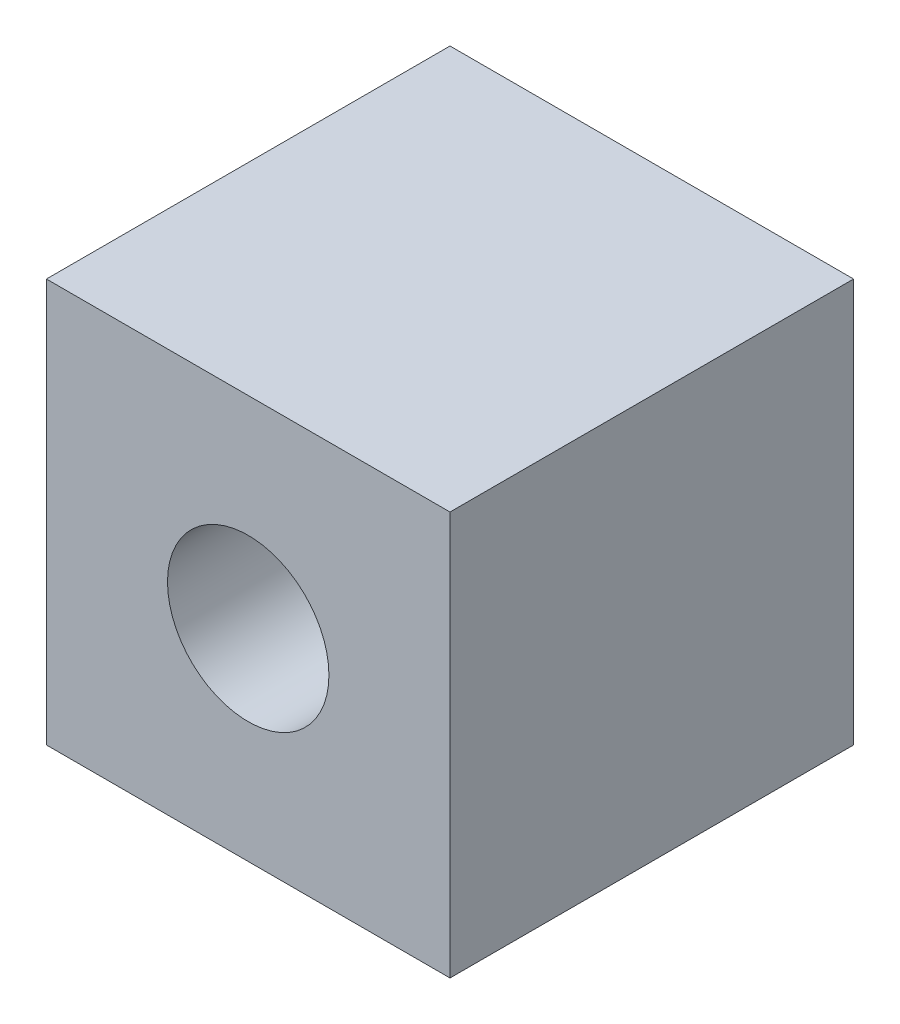
ISO-10303-21;
HEADER;
FILE_DESCRIPTION(('STEP AP214'),'2;1');
FILE_NAME('part.step','',(''),(''),'','','');
FILE_SCHEMA(('AUTOMOTIVE_DESIGN { 1 0 10303 214 1 1 1 1 }'));
ENDSEC;
DATA;
#1=APPLICATION_CONTEXT('core data for automotive mechanical design processes');
#2=APPLICATION_PROTOCOL_DEFINITION('international standard','automotive_design',2000,#1);
#3=PRODUCT_CONTEXT('',#1,'mechanical');
#4=PRODUCT('Part','Part','',(#3));
#5=PRODUCT_RELATED_PRODUCT_CATEGORY('part','',(#4));
#6=PRODUCT_DEFINITION_FORMATION('','',#4);
#7=PRODUCT_DEFINITION_CONTEXT('part definition',#1,'design');
#8=PRODUCT_DEFINITION('design','',#6,#7);
#9=PRODUCT_DEFINITION_SHAPE('','',#8);
#10=(LENGTH_UNIT() NAMED_UNIT(*) SI_UNIT(.MILLI.,.METRE.));
#11=(NAMED_UNIT(*) PLANE_ANGLE_UNIT() SI_UNIT($,.RADIAN.));
#12=(NAMED_UNIT(*) SI_UNIT($,.STERADIAN.) SOLID_ANGLE_UNIT());
#13=UNCERTAINTY_MEASURE_WITH_UNIT(LENGTH_MEASURE(1.E-05),#10,'distance_accuracy_value','');
#14=(GEOMETRIC_REPRESENTATION_CONTEXT(3) GLOBAL_UNCERTAINTY_ASSIGNED_CONTEXT((#13)) GLOBAL_UNIT_ASSIGNED_CONTEXT((#10,
#11,#12)) REPRESENTATION_CONTEXT('',''));
#15=CARTESIAN_POINT('',(0.,0.,0.));
#16=DIRECTION('',(0.,0.,1.));
#17=DIRECTION('',(1.,0.,0.));
#18=AXIS2_PLACEMENT_3D('',#15,#16,#17);
#19=CARTESIAN_POINT('',(0.,0.,10.));
#20=DIRECTION('',(1.,0.,0.));
#21=DIRECTION('',(0.,0.,-1.));
#22=AXIS2_PLACEMENT_3D('',#19,#20,#21);
#23=PLANE('',#22);
#24=DIRECTION('',(0.,-1.,0.));
#25=VECTOR('',#24,1.);
#26=CARTESIAN_POINT('',(0.,0.,0.));
#27=LINE('',#26,#25);
#28=CARTESIAN_POINT('',(0.,10.,0.));
#29=VERTEX_POINT('',#28);
#30=CARTESIAN_POINT('',(0.,0.,0.));
#31=VERTEX_POINT('',#30);
#32=EDGE_CURVE('E98',#29,#31,#27,.T.);
#33=ORIENTED_EDGE('',*,*,#32,.T.);
#34=DIRECTION('',(0.,0.,-1.));
#35=VECTOR('',#34,1.);
#36=CARTESIAN_POINT('',(0.,0.,10.));
#37=LINE('',#36,#35);
#38=CARTESIAN_POINT('',(0.,0.,10.));
#39=VERTEX_POINT('',#38);
#40=EDGE_CURVE('E11',#39,#31,#37,.T.);
#41=ORIENTED_EDGE('',*,*,#40,.F.);
#42=DIRECTION('',(0.,-1.,0.));
#43=VECTOR('',#42,1.);
#44=CARTESIAN_POINT('',(0.,0.,10.));
#45=LINE('',#44,#43);
#46=CARTESIAN_POINT('',(0.,10.,10.));
#47=VERTEX_POINT('',#46);
#48=EDGE_CURVE('E86',#47,#39,#45,.T.);
#49=ORIENTED_EDGE('',*,*,#48,.F.);
#50=DIRECTION('',(0.,0.,-1.));
#51=VECTOR('',#50,1.);
#52=CARTESIAN_POINT('',(0.,10.,10.));
#53=LINE('',#52,#51);
#54=EDGE_CURVE('E94',#47,#29,#53,.T.);
#55=ORIENTED_EDGE('',*,*,#54,.T.);
#56=EDGE_LOOP('',(#33,#41,#49,#55));
#57=FACE_BOUND('',#56,.T.);
#58=ADVANCED_FACE('F35',(#57),#23,.F.);
#59=CARTESIAN_POINT('',(0.,0.,10.));
#60=DIRECTION('',(0.,1.,0.));
#61=DIRECTION('',(0.,0.,1.));
#62=AXIS2_PLACEMENT_3D('',#59,#60,#61);
#63=PLANE('',#62);
#64=DIRECTION('',(1.,0.,0.));
#65=VECTOR('',#64,1.);
#66=CARTESIAN_POINT('',(0.,0.,0.));
#67=LINE('',#66,#65);
#68=CARTESIAN_POINT('',(10.,0.,0.));
#69=VERTEX_POINT('',#68);
#70=EDGE_CURVE('E90',#31,#69,#67,.T.);
#71=ORIENTED_EDGE('',*,*,#70,.T.);
#72=DIRECTION('',(0.,0.,-1.));
#73=VECTOR('',#72,1.);
#74=CARTESIAN_POINT('',(10.,0.,10.));
#75=LINE('',#74,#73);
#76=CARTESIAN_POINT('',(10.,0.,10.));
#77=VERTEX_POINT('',#76);
#78=EDGE_CURVE('E43',#77,#69,#75,.T.);
#79=ORIENTED_EDGE('',*,*,#78,.F.);
#80=DIRECTION('',(1.,0.,0.));
#81=VECTOR('',#80,1.);
#82=CARTESIAN_POINT('',(0.,0.,10.));
#83=LINE('',#82,#81);
#84=EDGE_CURVE('E81',#39,#77,#83,.T.);
#85=ORIENTED_EDGE('',*,*,#84,.F.);
#86=ORIENTED_EDGE('',*,*,#40,.T.);
#87=EDGE_LOOP('',(#71,#79,#85,#86));
#88=FACE_BOUND('',#87,.T.);
#89=ADVANCED_FACE('F89',(#88),#63,.F.);
#90=CARTESIAN_POINT('',(10.,0.,10.));
#91=DIRECTION('',(-1.,0.,0.));
#92=DIRECTION('',(0.,0.,1.));
#93=AXIS2_PLACEMENT_3D('',#90,#91,#92);
#94=PLANE('',#93);
#95=DIRECTION('',(0.,1.,0.));
#96=VECTOR('',#95,1.);
#97=CARTESIAN_POINT('',(10.,0.,0.));
#98=LINE('',#97,#96);
#99=CARTESIAN_POINT('',(10.,10.,0.));
#100=VERTEX_POINT('',#99);
#101=EDGE_CURVE('E68',#69,#100,#98,.T.);
#102=ORIENTED_EDGE('',*,*,#101,.T.);
#103=DIRECTION('',(0.,0.,-1.));
#104=VECTOR('',#103,1.);
#105=CARTESIAN_POINT('',(10.,10.,10.));
#106=LINE('',#105,#104);
#107=CARTESIAN_POINT('',(10.,10.,10.));
#108=VERTEX_POINT('',#107);
#109=EDGE_CURVE('E91',#108,#100,#106,.T.);
#110=ORIENTED_EDGE('',*,*,#109,.F.);
#111=DIRECTION('',(0.,1.,0.));
#112=VECTOR('',#111,1.);
#113=CARTESIAN_POINT('',(10.,0.,10.));
#114=LINE('',#113,#112);
#115=EDGE_CURVE('E84',#77,#108,#114,.T.);
#116=ORIENTED_EDGE('',*,*,#115,.F.);
#117=ORIENTED_EDGE('',*,*,#78,.T.);
#118=EDGE_LOOP('',(#102,#110,#116,#117));
#119=FACE_BOUND('',#118,.T.);
#120=ADVANCED_FACE('F92',(#119),#94,.F.);
#121=CARTESIAN_POINT('',(0.,10.,10.));
#122=DIRECTION('',(0.,-1.,0.));
#123=DIRECTION('',(0.,0.,-1.));
#124=AXIS2_PLACEMENT_3D('',#121,#122,#123);
#125=PLANE('',#124);
#126=DIRECTION('',(-1.,0.,0.));
#127=VECTOR('',#126,1.);
#128=CARTESIAN_POINT('',(0.,10.,0.));
#129=LINE('',#128,#127);
#130=EDGE_CURVE('E74',#100,#29,#129,.T.);
#131=ORIENTED_EDGE('',*,*,#130,.T.);
#132=ORIENTED_EDGE('',*,*,#54,.F.);
#133=DIRECTION('',(-1.,0.,0.));
#134=VECTOR('',#133,1.);
#135=CARTESIAN_POINT('',(0.,10.,10.));
#136=LINE('',#135,#134);
#137=EDGE_CURVE('E51',#108,#47,#136,.T.);
#138=ORIENTED_EDGE('',*,*,#137,.F.);
#139=ORIENTED_EDGE('',*,*,#109,.T.);
#140=EDGE_LOOP('',(#131,#132,#138,#139));
#141=FACE_BOUND('',#140,.T.);
#142=ADVANCED_FACE('F106',(#141),#125,.F.);
#143=CARTESIAN_POINT('',(0.,0.,10.));
#144=DIRECTION('',(0.,0.,-1.));
#145=DIRECTION('',(-1.,0.,0.));
#146=AXIS2_PLACEMENT_3D('',#143,#144,#145);
#147=PLANE('',#146);
#148=CARTESIAN_POINT('',(5.,5.,10.));
#149=DIRECTION('',(0.,0.,1.));
#150=DIRECTION('',(1.,0.,0.));
#151=AXIS2_PLACEMENT_3D('',#148,#149,#150);
#152=CIRCLE('',#151,2.);
#153=CARTESIAN_POINT('',(7.,5.,10.));
#154=VERTEX_POINT('',#153);
#155=EDGE_CURVE('E101',#154,#154,#152,.T.);
#156=ORIENTED_EDGE('',*,*,#155,.F.);
#157=EDGE_LOOP('',(#156));
#158=FACE_BOUND('',#157,.T.);
#159=ORIENTED_EDGE('',*,*,#48,.T.);
#160=ORIENTED_EDGE('',*,*,#84,.T.);
#161=ORIENTED_EDGE('',*,*,#115,.T.);
#162=ORIENTED_EDGE('',*,*,#137,.T.);
#163=EDGE_LOOP('',(#159,#160,#161,#162));
#164=FACE_BOUND('',#163,.T.);
#165=ADVANCED_FACE('F82',(#158,#164),#147,.F.);
#166=CARTESIAN_POINT('',(0.,0.,0.));
#167=DIRECTION('',(0.,0.,-1.));
#168=DIRECTION('',(-1.,0.,0.));
#169=AXIS2_PLACEMENT_3D('',#166,#167,#168);
#170=PLANE('',#169);
#171=CARTESIAN_POINT('',(5.,5.,0.));
#172=DIRECTION('',(0.,0.,1.));
#173=DIRECTION('',(1.,0.,0.));
#174=AXIS2_PLACEMENT_3D('',#171,#172,#173);
#175=CIRCLE('',#174,2.);
#176=CARTESIAN_POINT('',(7.,5.,0.));
#177=VERTEX_POINT('',#176);
#178=EDGE_CURVE('E112',#177,#177,#175,.T.);
#179=ORIENTED_EDGE('',*,*,#178,.T.);
#180=EDGE_LOOP('',(#179));
#181=FACE_BOUND('',#180,.T.);
#182=ORIENTED_EDGE('',*,*,#32,.F.);
#183=ORIENTED_EDGE('',*,*,#130,.F.);
#184=ORIENTED_EDGE('',*,*,#101,.F.);
#185=ORIENTED_EDGE('',*,*,#70,.F.);
#186=EDGE_LOOP('',(#182,#183,#184,#185));
#187=FACE_BOUND('',#186,.T.);
#188=ADVANCED_FACE('F109',(#181,#187),#170,.T.);
#189=CARTESIAN_POINT('',(5.,5.,10.));
#190=DIRECTION('',(0.,0.,-1.));
#191=DIRECTION('',(-1.,0.,0.));
#192=AXIS2_PLACEMENT_3D('',#189,#190,#191);
#193=CYLINDRICAL_SURFACE('',#192,2.);
#194=ORIENTED_EDGE('',*,*,#155,.T.);
#195=EDGE_LOOP('',(#194));
#196=FACE_BOUND('',#195,.T.);
#197=ORIENTED_EDGE('',*,*,#178,.F.);
#198=EDGE_LOOP('',(#197));
#199=FACE_BOUND('',#198,.T.);
#200=ADVANCED_FACE('F118',(#196,#199),#193,.F.);
#201=CLOSED_SHELL('',(#58,#89,#120,#142,#165,#188,#200));
#202=MANIFOLD_SOLID_BREP('B2',#201);
#203=ADVANCED_BREP_SHAPE_REPRESENTATION('',(#18,#202),#14);
#204=SHAPE_DEFINITION_REPRESENTATION(#9,#203);
ENDSEC;
END-ISO-10303-21;
